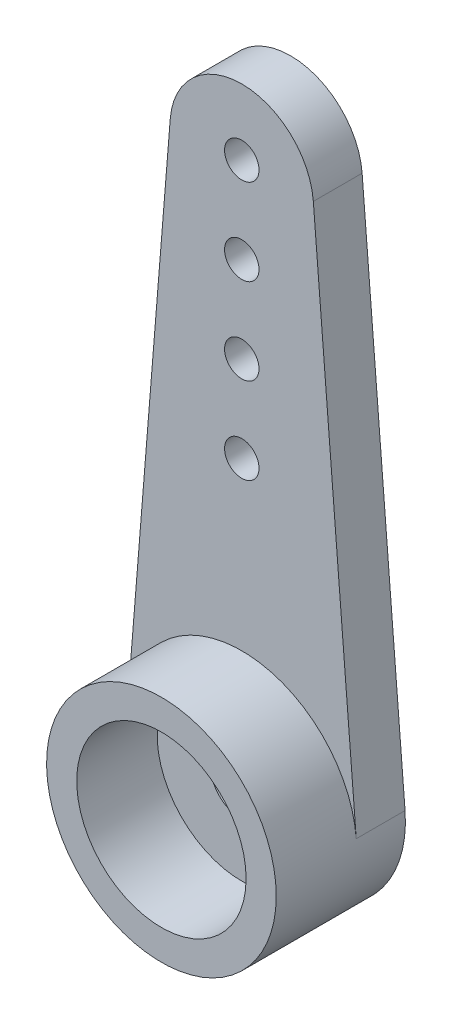
ISO-10303-21;
HEADER;
FILE_DESCRIPTION(('STEP AP214'),'2;1');
FILE_NAME('part.step','',(''),(''),'','','');
FILE_SCHEMA(('AUTOMOTIVE_DESIGN { 1 0 10303 214 1 1 1 1 }'));
ENDSEC;
DATA;
#1=APPLICATION_CONTEXT('core data for automotive mechanical design processes');
#2=APPLICATION_PROTOCOL_DEFINITION('international standard','automotive_design',2000,#1);
#3=PRODUCT_CONTEXT('',#1,'mechanical');
#4=PRODUCT('Part','Part','',(#3));
#5=PRODUCT_RELATED_PRODUCT_CATEGORY('part','',(#4));
#6=PRODUCT_DEFINITION_FORMATION('','',#4);
#7=PRODUCT_DEFINITION_CONTEXT('part definition',#1,'design');
#8=PRODUCT_DEFINITION('design','',#6,#7);
#9=PRODUCT_DEFINITION_SHAPE('','',#8);
#10=(LENGTH_UNIT() NAMED_UNIT(*) SI_UNIT(.MILLI.,.METRE.));
#11=(NAMED_UNIT(*) PLANE_ANGLE_UNIT() SI_UNIT($,.RADIAN.));
#12=(NAMED_UNIT(*) SI_UNIT($,.STERADIAN.) SOLID_ANGLE_UNIT());
#13=UNCERTAINTY_MEASURE_WITH_UNIT(LENGTH_MEASURE(1.E-05),#10,'distance_accuracy_value','');
#14=(GEOMETRIC_REPRESENTATION_CONTEXT(3) GLOBAL_UNCERTAINTY_ASSIGNED_CONTEXT((#13)) GLOBAL_UNIT_ASSIGNED_CONTEXT((#10,
#11,#12)) REPRESENTATION_CONTEXT('',''));
#15=CARTESIAN_POINT('',(0.,0.,0.));
#16=DIRECTION('',(0.,0.,1.));
#17=DIRECTION('',(1.,0.,0.));
#18=AXIS2_PLACEMENT_3D('',#15,#16,#17);
#19=CARTESIAN_POINT('',(0.,0.,0.));
#20=DIRECTION('',(0.,0.,1.));
#21=DIRECTION('',(1.,0.,0.));
#22=AXIS2_PLACEMENT_3D('',#19,#20,#21);
#23=PLANE('',#22);
#24=CARTESIAN_POINT('',(0.,0.,0.));
#25=DIRECTION('',(0.,0.,1.));
#26=DIRECTION('',(1.,0.,0.));
#27=AXIS2_PLACEMENT_3D('',#24,#25,#26);
#28=CIRCLE('',#27,4.);
#29=CARTESIAN_POINT('',(-3.98697149818849,0.32258064516129,0.));
#30=VERTEX_POINT('',#29);
#31=CARTESIAN_POINT('',(3.98697149818848,0.32258064516129,0.));
#32=VERTEX_POINT('',#31);
#33=EDGE_CURVE('E141',#30,#32,#28,.T.);
#34=ORIENTED_EDGE('',*,*,#33,.F.);
#35=DIRECTION('',(-0.0806451612903226,-0.996742874547121,0.));
#36=VECTOR('',#35,1.);
#37=CARTESIAN_POINT('',(-3.98697149818849,0.32258064516129,0.));
#38=LINE('',#37,#36);
#39=CARTESIAN_POINT('',(-2.4918571863678,18.8016129032258,0.));
#40=VERTEX_POINT('',#39);
#41=EDGE_CURVE('E121',#40,#30,#38,.T.);
#42=ORIENTED_EDGE('',*,*,#41,.F.);
#43=CARTESIAN_POINT('',(0.,18.6,0.));
#44=DIRECTION('',(0.,0.,1.));
#45=DIRECTION('',(1.,0.,0.));
#46=AXIS2_PLACEMENT_3D('',#43,#44,#45);
#47=CIRCLE('',#46,2.5);
#48=CARTESIAN_POINT('',(2.4918571863678,18.8016129032258,0.));
#49=VERTEX_POINT('',#48);
#50=EDGE_CURVE('E83',#40,#49,#47,.F.);
#51=ORIENTED_EDGE('',*,*,#50,.T.);
#52=DIRECTION('',(0.0806451612903226,-0.996742874547121,0.));
#53=VECTOR('',#52,1.);
#54=CARTESIAN_POINT('',(3.98697149818849,0.32258064516129,0.));
#55=LINE('',#54,#53);
#56=EDGE_CURVE('E123',#49,#32,#55,.T.);
#57=ORIENTED_EDGE('',*,*,#56,.T.);
#58=EDGE_LOOP('',(#34,#42,#51,#57));
#59=FACE_BOUND('',#58,.T.);
#60=CARTESIAN_POINT('',(0.,0.,0.));
#61=DIRECTION('',(0.,0.,1.));
#62=DIRECTION('',(1.,0.,0.));
#63=AXIS2_PLACEMENT_3D('',#60,#61,#62);
#64=CIRCLE('',#63,2.95);
#65=CARTESIAN_POINT('',(2.95,0.,0.));
#66=VERTEX_POINT('',#65);
#67=EDGE_CURVE('E87',#66,#66,#64,.T.);
#68=ORIENTED_EDGE('',*,*,#67,.T.);
#69=EDGE_LOOP('',(#68));
#70=FACE_BOUND('',#69,.T.);
#71=CARTESIAN_POINT('',(0.,9.80161290322581,0.));
#72=DIRECTION('',(0.,0.,1.));
#73=DIRECTION('',(1.,0.,0.));
#74=AXIS2_PLACEMENT_3D('',#71,#72,#73);
#75=CIRCLE('',#74,0.6);
#76=CARTESIAN_POINT('',(0.6,9.80161290322581,0.));
#77=VERTEX_POINT('',#76);
#78=EDGE_CURVE('E108',#77,#77,#75,.T.);
#79=ORIENTED_EDGE('',*,*,#78,.T.);
#80=EDGE_LOOP('',(#79));
#81=FACE_BOUND('',#80,.T.);
#82=CARTESIAN_POINT('',(0.,12.8016129032258,0.));
#83=DIRECTION('',(0.,0.,1.));
#84=DIRECTION('',(1.,0.,0.));
#85=AXIS2_PLACEMENT_3D('',#82,#83,#84);
#86=CIRCLE('',#85,0.6);
#87=CARTESIAN_POINT('',(0.6,12.8016129032258,0.));
#88=VERTEX_POINT('',#87);
#89=EDGE_CURVE('E111',#88,#88,#86,.T.);
#90=ORIENTED_EDGE('',*,*,#89,.T.);
#91=EDGE_LOOP('',(#90));
#92=FACE_BOUND('',#91,.T.);
#93=CARTESIAN_POINT('',(0.,15.8016129032258,0.));
#94=DIRECTION('',(0.,0.,1.));
#95=DIRECTION('',(1.,0.,0.));
#96=AXIS2_PLACEMENT_3D('',#93,#94,#95);
#97=CIRCLE('',#96,0.6);
#98=CARTESIAN_POINT('',(0.6,15.8016129032258,0.));
#99=VERTEX_POINT('',#98);
#100=EDGE_CURVE('E114',#99,#99,#97,.T.);
#101=ORIENTED_EDGE('',*,*,#100,.T.);
#102=EDGE_LOOP('',(#101));
#103=FACE_BOUND('',#102,.T.);
#104=CARTESIAN_POINT('',(0.,18.8016129032258,0.));
#105=DIRECTION('',(0.,0.,1.));
#106=DIRECTION('',(1.,0.,0.));
#107=AXIS2_PLACEMENT_3D('',#104,#105,#106);
#108=CIRCLE('',#107,0.6);
#109=CARTESIAN_POINT('',(0.6,18.8016129032258,0.));
#110=VERTEX_POINT('',#109);
#111=EDGE_CURVE('E117',#110,#110,#108,.T.);
#112=ORIENTED_EDGE('',*,*,#111,.T.);
#113=EDGE_LOOP('',(#112));
#114=FACE_BOUND('',#113,.T.);
#115=ADVANCED_FACE('F36',(#59,#70,#81,#92,#103,#114),#23,.F.);
#116=CARTESIAN_POINT('',(0.,0.,4.5));
#117=DIRECTION('',(0.,0.,-1.));
#118=DIRECTION('',(-1.,0.,0.));
#119=AXIS2_PLACEMENT_3D('',#116,#117,#118);
#120=CYLINDRICAL_SURFACE('',#119,2.95);
#121=CARTESIAN_POINT('',(0.,0.,1.7));
#122=DIRECTION('',(0.,0.,1.));
#123=DIRECTION('',(1.,0.,0.));
#124=AXIS2_PLACEMENT_3D('',#121,#122,#123);
#125=CIRCLE('',#124,2.95);
#126=CARTESIAN_POINT('',(2.95,0.,1.7));
#127=VERTEX_POINT('',#126);
#128=EDGE_CURVE('E11',#127,#127,#125,.T.);
#129=ORIENTED_EDGE('',*,*,#128,.F.);
#130=EDGE_LOOP('',(#129));
#131=FACE_BOUND('',#130,.T.);
#132=CARTESIAN_POINT('',(0.,0.,4.5));
#133=DIRECTION('',(0.,0.,1.));
#134=DIRECTION('',(1.,0.,0.));
#135=AXIS2_PLACEMENT_3D('',#132,#133,#134);
#136=CIRCLE('',#135,2.95);
#137=CARTESIAN_POINT('',(2.95,0.,4.5));
#138=VERTEX_POINT('',#137);
#139=EDGE_CURVE('E142',#138,#138,#136,.T.);
#140=ORIENTED_EDGE('',*,*,#139,.T.);
#141=EDGE_LOOP('',(#140));
#142=FACE_BOUND('',#141,.T.);
#143=ADVANCED_FACE('F38',(#131,#142),#120,.F.);
#144=CARTESIAN_POINT('',(0.,0.,4.5));
#145=DIRECTION('',(0.,0.,-1.));
#146=DIRECTION('',(-1.,0.,0.));
#147=AXIS2_PLACEMENT_3D('',#144,#145,#146);
#148=CYLINDRICAL_SURFACE('',#147,4.);
#149=CARTESIAN_POINT('',(0.,0.,1.7));
#150=DIRECTION('',(0.,0.,1.));
#151=DIRECTION('',(1.,0.,0.));
#152=AXIS2_PLACEMENT_3D('',#149,#150,#151);
#153=CIRCLE('',#152,4.);
#154=CARTESIAN_POINT('',(3.98697149818848,0.32258064516129,1.7));
#155=VERTEX_POINT('',#154);
#156=CARTESIAN_POINT('',(-3.98697149818848,0.32258064516129,1.7));
#157=VERTEX_POINT('',#156);
#158=EDGE_CURVE('E51',#155,#157,#153,.T.);
#159=ORIENTED_EDGE('',*,*,#158,.T.);
#160=DIRECTION('',(0.,0.,-1.));
#161=VECTOR('',#160,1.);
#162=CARTESIAN_POINT('',(-3.98697149818849,0.32258064516129,1.7));
#163=LINE('',#162,#161);
#164=EDGE_CURVE('E88',#157,#30,#163,.T.);
#165=ORIENTED_EDGE('',*,*,#164,.T.);
#166=ORIENTED_EDGE('',*,*,#33,.T.);
#167=DIRECTION('',(0.,0.,-1.));
#168=VECTOR('',#167,1.);
#169=CARTESIAN_POINT('',(3.98697149818849,0.32258064516129,1.7));
#170=LINE('',#169,#168);
#171=EDGE_CURVE('E56',#155,#32,#170,.T.);
#172=ORIENTED_EDGE('',*,*,#171,.F.);
#173=EDGE_LOOP('',(#159,#165,#166,#172));
#174=FACE_BOUND('',#173,.T.);
#175=CARTESIAN_POINT('',(0.,0.,4.5));
#176=DIRECTION('',(0.,0.,1.));
#177=DIRECTION('',(1.,0.,0.));
#178=AXIS2_PLACEMENT_3D('',#175,#176,#177);
#179=CIRCLE('',#178,4.);
#180=CARTESIAN_POINT('',(4.,0.,4.5));
#181=VERTEX_POINT('',#180);
#182=EDGE_CURVE('E44',#181,#181,#179,.T.);
#183=ORIENTED_EDGE('',*,*,#182,.F.);
#184=EDGE_LOOP('',(#183));
#185=FACE_BOUND('',#184,.T.);
#186=ADVANCED_FACE('F146',(#174,#185),#148,.T.);
#187=CARTESIAN_POINT('',(0.,0.,4.5));
#188=DIRECTION('',(0.,0.,1.));
#189=DIRECTION('',(1.,0.,0.));
#190=AXIS2_PLACEMENT_3D('',#187,#188,#189);
#191=PLANE('',#190);
#192=ORIENTED_EDGE('',*,*,#139,.F.);
#193=EDGE_LOOP('',(#192));
#194=FACE_BOUND('',#193,.T.);
#195=ORIENTED_EDGE('',*,*,#182,.T.);
#196=EDGE_LOOP('',(#195));
#197=FACE_BOUND('',#196,.T.);
#198=ADVANCED_FACE('F202',(#194,#197),#191,.T.);
#199=CARTESIAN_POINT('',(0.,0.,1.7));
#200=DIRECTION('',(0.,0.,-1.));
#201=DIRECTION('',(-1.,0.,0.));
#202=AXIS2_PLACEMENT_3D('',#199,#200,#201);
#203=CYLINDRICAL_SURFACE('',#202,1.1);
#204=CARTESIAN_POINT('',(0.,0.,0.4));
#205=DIRECTION('',(0.,0.,1.));
#206=DIRECTION('',(1.,0.,0.));
#207=AXIS2_PLACEMENT_3D('',#204,#205,#206);
#208=CIRCLE('',#207,1.1);
#209=CARTESIAN_POINT('',(1.1,0.,0.4));
#210=VERTEX_POINT('',#209);
#211=EDGE_CURVE('E133',#210,#210,#208,.T.);
#212=ORIENTED_EDGE('',*,*,#211,.F.);
#213=EDGE_LOOP('',(#212));
#214=FACE_BOUND('',#213,.T.);
#215=CARTESIAN_POINT('',(0.,0.,1.7));
#216=DIRECTION('',(0.,0.,1.));
#217=DIRECTION('',(1.,0.,0.));
#218=AXIS2_PLACEMENT_3D('',#215,#216,#217);
#219=CIRCLE('',#218,1.1);
#220=CARTESIAN_POINT('',(1.1,0.,1.7));
#221=VERTEX_POINT('',#220);
#222=EDGE_CURVE('E136',#221,#221,#219,.T.);
#223=ORIENTED_EDGE('',*,*,#222,.T.);
#224=EDGE_LOOP('',(#223));
#225=FACE_BOUND('',#224,.T.);
#226=ADVANCED_FACE('F198',(#214,#225),#203,.F.);
#227=CARTESIAN_POINT('',(0.,0.,1.7));
#228=DIRECTION('',(0.,0.,1.));
#229=DIRECTION('',(1.,0.,0.));
#230=AXIS2_PLACEMENT_3D('',#227,#228,#229);
#231=PLANE('',#230);
#232=ORIENTED_EDGE('',*,*,#128,.T.);
#233=EDGE_LOOP('',(#232));
#234=FACE_BOUND('',#233,.T.);
#235=ORIENTED_EDGE('',*,*,#222,.F.);
#236=EDGE_LOOP('',(#235));
#237=FACE_BOUND('',#236,.T.);
#238=ADVANCED_FACE('F194',(#234,#237),#231,.T.);
#239=CARTESIAN_POINT('',(0.,0.,0.4));
#240=DIRECTION('',(0.,0.,-1.));
#241=DIRECTION('',(-1.,0.,0.));
#242=AXIS2_PLACEMENT_3D('',#239,#240,#241);
#243=CYLINDRICAL_SURFACE('',#242,2.95);
#244=CARTESIAN_POINT('',(0.,0.,0.4));
#245=DIRECTION('',(0.,0.,1.));
#246=DIRECTION('',(1.,0.,0.));
#247=AXIS2_PLACEMENT_3D('',#244,#245,#246);
#248=CIRCLE('',#247,2.95);
#249=CARTESIAN_POINT('',(2.95,0.,0.4));
#250=VERTEX_POINT('',#249);
#251=EDGE_CURVE('E130',#250,#250,#248,.T.);
#252=ORIENTED_EDGE('',*,*,#251,.T.);
#253=EDGE_LOOP('',(#252));
#254=FACE_BOUND('',#253,.T.);
#255=ORIENTED_EDGE('',*,*,#67,.F.);
#256=EDGE_LOOP('',(#255));
#257=FACE_BOUND('',#256,.T.);
#258=ADVANCED_FACE('F190',(#254,#257),#243,.F.);
#259=CARTESIAN_POINT('',(0.,0.,0.4));
#260=DIRECTION('',(0.,0.,1.));
#261=DIRECTION('',(1.,0.,0.));
#262=AXIS2_PLACEMENT_3D('',#259,#260,#261);
#263=PLANE('',#262);
#264=ORIENTED_EDGE('',*,*,#251,.F.);
#265=EDGE_LOOP('',(#264));
#266=FACE_BOUND('',#265,.T.);
#267=ORIENTED_EDGE('',*,*,#211,.T.);
#268=EDGE_LOOP('',(#267));
#269=FACE_BOUND('',#268,.T.);
#270=ADVANCED_FACE('F187',(#266,#269),#263,.F.);
#271=CARTESIAN_POINT('',(0.,18.6,1.7));
#272=DIRECTION('',(0.,0.,-1.));
#273=DIRECTION('',(-1.,0.,0.));
#274=AXIS2_PLACEMENT_3D('',#271,#272,#273);
#275=CYLINDRICAL_SURFACE('',#274,2.5);
#276=ORIENTED_EDGE('',*,*,#50,.F.);
#277=DIRECTION('',(0.,0.,-1.));
#278=VECTOR('',#277,1.);
#279=CARTESIAN_POINT('',(-2.4918571863678,18.8016129032258,1.7));
#280=LINE('',#279,#278);
#281=CARTESIAN_POINT('',(-2.4918571863678,18.8016129032258,1.7));
#282=VERTEX_POINT('',#281);
#283=EDGE_CURVE('E76',#282,#40,#280,.T.);
#284=ORIENTED_EDGE('',*,*,#283,.F.);
#285=CARTESIAN_POINT('',(0.,18.6,1.7));
#286=DIRECTION('',(0.,0.,1.));
#287=DIRECTION('',(1.,0.,0.));
#288=AXIS2_PLACEMENT_3D('',#285,#286,#287);
#289=CIRCLE('',#288,2.5);
#290=CARTESIAN_POINT('',(2.4918571863678,18.8016129032258,1.7));
#291=VERTEX_POINT('',#290);
#292=EDGE_CURVE('E80',#282,#291,#289,.F.);
#293=ORIENTED_EDGE('',*,*,#292,.T.);
#294=DIRECTION('',(0.,0.,-1.));
#295=VECTOR('',#294,1.);
#296=CARTESIAN_POINT('',(2.4918571863678,18.8016129032258,1.7));
#297=LINE('',#296,#295);
#298=EDGE_CURVE('E107',#291,#49,#297,.T.);
#299=ORIENTED_EDGE('',*,*,#298,.T.);
#300=EDGE_LOOP('',(#276,#284,#293,#299));
#301=FACE_BOUND('',#300,.T.);
#302=ADVANCED_FACE('F78',(#301),#275,.T.);
#303=CARTESIAN_POINT('',(-3.98697149818849,0.32258064516129,1.7));
#304=DIRECTION('',(0.996742874547121,-0.0806451612903226,0.));
#305=DIRECTION('',(0.0806451612903226,0.996742874547121,0.));
#306=AXIS2_PLACEMENT_3D('',#303,#304,#305);
#307=PLANE('',#306);
#308=ORIENTED_EDGE('',*,*,#41,.T.);
#309=ORIENTED_EDGE('',*,*,#164,.F.);
#310=DIRECTION('',(-0.0806451612903226,-0.996742874547121,0.));
#311=VECTOR('',#310,1.);
#312=CARTESIAN_POINT('',(-3.98697149818849,0.32258064516129,1.7));
#313=LINE('',#312,#311);
#314=EDGE_CURVE('E91',#282,#157,#313,.T.);
#315=ORIENTED_EDGE('',*,*,#314,.F.);
#316=ORIENTED_EDGE('',*,*,#283,.T.);
#317=EDGE_LOOP('',(#308,#309,#315,#316));
#318=FACE_BOUND('',#317,.T.);
#319=ADVANCED_FACE('F92',(#318),#307,.F.);
#320=CARTESIAN_POINT('',(0.,18.8016129032258,1.7));
#321=DIRECTION('',(0.,0.,-1.));
#322=DIRECTION('',(-1.,0.,0.));
#323=AXIS2_PLACEMENT_3D('',#320,#321,#322);
#324=CYLINDRICAL_SURFACE('',#323,0.6);
#325=CARTESIAN_POINT('',(0.,18.8016129032258,1.7));
#326=DIRECTION('',(0.,0.,1.));
#327=DIRECTION('',(1.,0.,0.));
#328=AXIS2_PLACEMENT_3D('',#325,#326,#327);
#329=CIRCLE('',#328,0.6);
#330=CARTESIAN_POINT('',(0.6,18.8016129032258,1.7));
#331=VERTEX_POINT('',#330);
#332=EDGE_CURVE('E98',#331,#331,#329,.T.);
#333=ORIENTED_EDGE('',*,*,#332,.T.);
#334=EDGE_LOOP('',(#333));
#335=FACE_BOUND('',#334,.T.);
#336=ORIENTED_EDGE('',*,*,#111,.F.);
#337=EDGE_LOOP('',(#336));
#338=FACE_BOUND('',#337,.T.);
#339=ADVANCED_FACE('F165',(#335,#338),#324,.F.);
#340=CARTESIAN_POINT('',(0.,15.8016129032258,1.7));
#341=DIRECTION('',(0.,0.,-1.));
#342=DIRECTION('',(-1.,0.,0.));
#343=AXIS2_PLACEMENT_3D('',#340,#341,#342);
#344=CYLINDRICAL_SURFACE('',#343,0.6);
#345=CARTESIAN_POINT('',(0.,15.8016129032258,1.7));
#346=DIRECTION('',(0.,0.,1.));
#347=DIRECTION('',(1.,0.,0.));
#348=AXIS2_PLACEMENT_3D('',#345,#346,#347);
#349=CIRCLE('',#348,0.6);
#350=CARTESIAN_POINT('',(0.6,15.8016129032258,1.7));
#351=VERTEX_POINT('',#350);
#352=EDGE_CURVE('E101',#351,#351,#349,.T.);
#353=ORIENTED_EDGE('',*,*,#352,.T.);
#354=EDGE_LOOP('',(#353));
#355=FACE_BOUND('',#354,.T.);
#356=ORIENTED_EDGE('',*,*,#100,.F.);
#357=EDGE_LOOP('',(#356));
#358=FACE_BOUND('',#357,.T.);
#359=ADVANCED_FACE('F167',(#355,#358),#344,.F.);
#360=CARTESIAN_POINT('',(0.,12.8016129032258,1.7));
#361=DIRECTION('',(0.,0.,-1.));
#362=DIRECTION('',(-1.,0.,0.));
#363=AXIS2_PLACEMENT_3D('',#360,#361,#362);
#364=CYLINDRICAL_SURFACE('',#363,0.6);
#365=CARTESIAN_POINT('',(0.,12.8016129032258,1.7));
#366=DIRECTION('',(0.,0.,1.));
#367=DIRECTION('',(1.,0.,0.));
#368=AXIS2_PLACEMENT_3D('',#365,#366,#367);
#369=CIRCLE('',#368,0.6);
#370=CARTESIAN_POINT('',(0.6,12.8016129032258,1.7));
#371=VERTEX_POINT('',#370);
#372=EDGE_CURVE('E299',#371,#371,#369,.T.);
#373=ORIENTED_EDGE('',*,*,#372,.T.);
#374=EDGE_LOOP('',(#373));
#375=FACE_BOUND('',#374,.T.);
#376=ORIENTED_EDGE('',*,*,#89,.F.);
#377=EDGE_LOOP('',(#376));
#378=FACE_BOUND('',#377,.T.);
#379=ADVANCED_FACE('F174',(#375,#378),#364,.F.);
#380=CARTESIAN_POINT('',(0.,9.80161290322581,1.7));
#381=DIRECTION('',(0.,0.,-1.));
#382=DIRECTION('',(-1.,0.,0.));
#383=AXIS2_PLACEMENT_3D('',#380,#381,#382);
#384=CYLINDRICAL_SURFACE('',#383,0.6);
#385=CARTESIAN_POINT('',(0.,9.80161290322581,1.7));
#386=DIRECTION('',(0.,0.,1.));
#387=DIRECTION('',(1.,0.,0.));
#388=AXIS2_PLACEMENT_3D('',#385,#386,#387);
#389=CIRCLE('',#388,0.6);
#390=CARTESIAN_POINT('',(0.6,9.80161290322581,1.7));
#391=VERTEX_POINT('',#390);
#392=EDGE_CURVE('E126',#391,#391,#389,.T.);
#393=ORIENTED_EDGE('',*,*,#392,.T.);
#394=EDGE_LOOP('',(#393));
#395=FACE_BOUND('',#394,.T.);
#396=ORIENTED_EDGE('',*,*,#78,.F.);
#397=EDGE_LOOP('',(#396));
#398=FACE_BOUND('',#397,.T.);
#399=ADVANCED_FACE('F182',(#395,#398),#384,.F.);
#400=CARTESIAN_POINT('',(3.98697149818849,0.32258064516129,1.7));
#401=DIRECTION('',(0.996742874547121,0.0806451612903226,0.));
#402=DIRECTION('',(-0.0806451612903226,0.996742874547121,0.));
#403=AXIS2_PLACEMENT_3D('',#400,#401,#402);
#404=PLANE('',#403);
#405=ORIENTED_EDGE('',*,*,#56,.F.);
#406=ORIENTED_EDGE('',*,*,#298,.F.);
#407=DIRECTION('',(0.0806451612903226,-0.996742874547121,0.));
#408=VECTOR('',#407,1.);
#409=CARTESIAN_POINT('',(3.98697149818849,0.32258064516129,1.7));
#410=LINE('',#409,#408);
#411=EDGE_CURVE('E97',#291,#155,#410,.T.);
#412=ORIENTED_EDGE('',*,*,#411,.T.);
#413=ORIENTED_EDGE('',*,*,#171,.T.);
#414=EDGE_LOOP('',(#405,#406,#412,#413));
#415=FACE_BOUND('',#414,.T.);
#416=ADVANCED_FACE('F151',(#415),#404,.T.);
#417=CARTESIAN_POINT('',(0.,0.,1.7));
#418=DIRECTION('',(0.,0.,1.));
#419=DIRECTION('',(1.,0.,0.));
#420=AXIS2_PLACEMENT_3D('',#417,#418,#419);
#421=PLANE('',#420);
#422=ORIENTED_EDGE('',*,*,#392,.F.);
#423=EDGE_LOOP('',(#422));
#424=FACE_BOUND('',#423,.T.);
#425=ORIENTED_EDGE('',*,*,#372,.F.);
#426=EDGE_LOOP('',(#425));
#427=FACE_BOUND('',#426,.T.);
#428=ORIENTED_EDGE('',*,*,#352,.F.);
#429=EDGE_LOOP('',(#428));
#430=FACE_BOUND('',#429,.T.);
#431=ORIENTED_EDGE('',*,*,#332,.F.);
#432=EDGE_LOOP('',(#431));
#433=FACE_BOUND('',#432,.T.);
#434=ORIENTED_EDGE('',*,*,#292,.F.);
#435=ORIENTED_EDGE('',*,*,#314,.T.);
#436=ORIENTED_EDGE('',*,*,#158,.F.);
#437=ORIENTED_EDGE('',*,*,#411,.F.);
#438=EDGE_LOOP('',(#434,#435,#436,#437));
#439=FACE_BOUND('',#438,.T.);
#440=ADVANCED_FACE('F95',(#424,#427,#430,#433,#439),#421,.T.);
#441=CLOSED_SHELL('',(#115,#143,#186,#198,#226,#238,#258,#270,#302,#319,#339,#359,#379,#399,
#416,#440));
#442=MANIFOLD_SOLID_BREP('B2',#441);
#443=ADVANCED_BREP_SHAPE_REPRESENTATION('',(#18,#442),#14);
#444=SHAPE_DEFINITION_REPRESENTATION(#9,#443);
ENDSEC;
END-ISO-10303-21;
